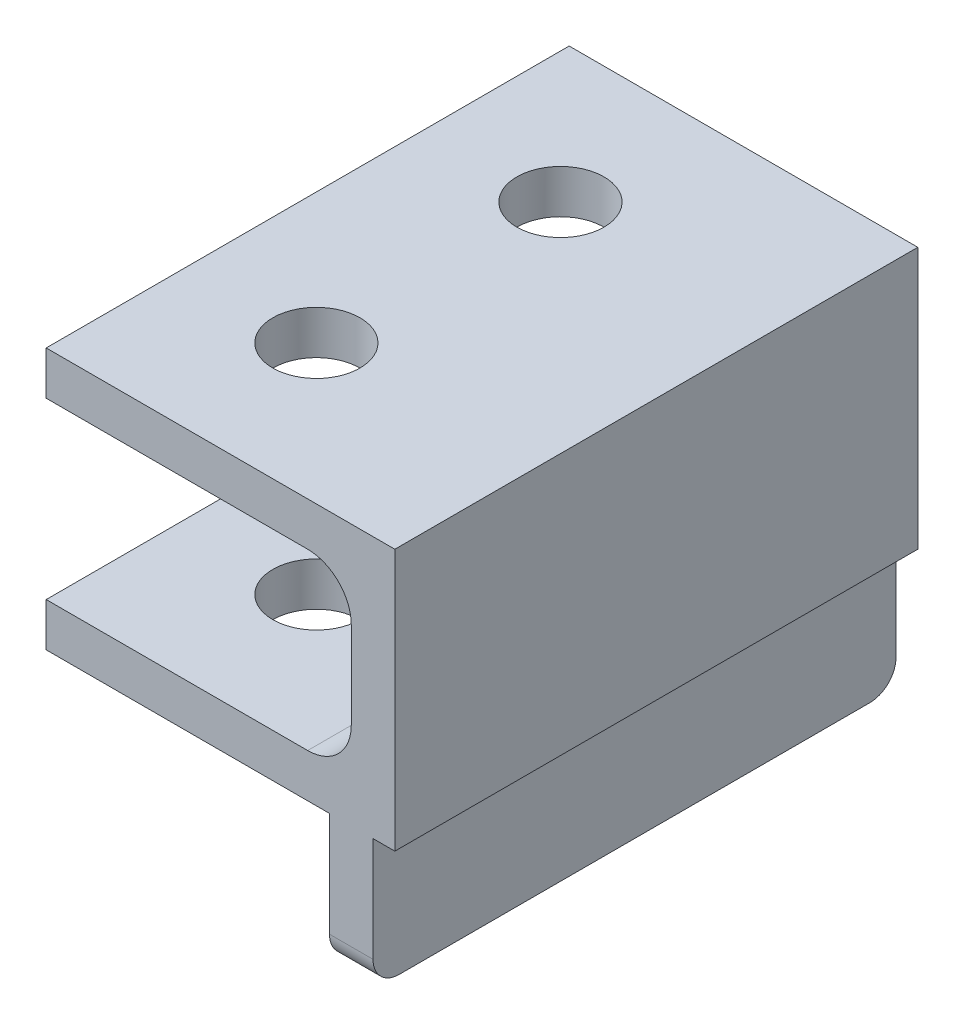
ISO-10303-21;
HEADER;
FILE_DESCRIPTION(('STEP AP214'),'2;1');
FILE_NAME('part.step','',(''),(''),'','','');
FILE_SCHEMA(('AUTOMOTIVE_DESIGN { 1 0 10303 214 1 1 1 1 }'));
ENDSEC;
DATA;
#1=APPLICATION_CONTEXT('core data for automotive mechanical design processes');
#2=APPLICATION_PROTOCOL_DEFINITION('international standard','automotive_design',2000,#1);
#3=PRODUCT_CONTEXT('',#1,'mechanical');
#4=PRODUCT('Part','Part','',(#3));
#5=PRODUCT_RELATED_PRODUCT_CATEGORY('part','',(#4));
#6=PRODUCT_DEFINITION_FORMATION('','',#4);
#7=PRODUCT_DEFINITION_CONTEXT('part definition',#1,'design');
#8=PRODUCT_DEFINITION('design','',#6,#7);
#9=PRODUCT_DEFINITION_SHAPE('','',#8);
#10=(LENGTH_UNIT() NAMED_UNIT(*) SI_UNIT(.MILLI.,.METRE.));
#11=(NAMED_UNIT(*) PLANE_ANGLE_UNIT() SI_UNIT($,.RADIAN.));
#12=(NAMED_UNIT(*) SI_UNIT($,.STERADIAN.) SOLID_ANGLE_UNIT());
#13=UNCERTAINTY_MEASURE_WITH_UNIT(LENGTH_MEASURE(1.E-05),#10,'distance_accuracy_value','');
#14=(GEOMETRIC_REPRESENTATION_CONTEXT(3) GLOBAL_UNCERTAINTY_ASSIGNED_CONTEXT((#13)) GLOBAL_UNIT_ASSIGNED_CONTEXT((#10,
#11,#12)) REPRESENTATION_CONTEXT('',''));
#15=CARTESIAN_POINT('',(0.,0.,0.));
#16=DIRECTION('',(0.,0.,1.));
#17=DIRECTION('',(1.,0.,0.));
#18=AXIS2_PLACEMENT_3D('',#15,#16,#17);
#19=CARTESIAN_POINT('',(0.,-25.,60.));
#20=DIRECTION('',(0.,1.,0.));
#21=DIRECTION('',(0.,0.,1.));
#22=AXIS2_PLACEMENT_3D('',#19,#20,#21);
#23=PLANE('',#22);
#24=DIRECTION('',(0.,0.,1.));
#25=VECTOR('',#24,1.);
#26=CARTESIAN_POINT('',(37.5,-25.,0.));
#27=LINE('',#26,#25);
#28=CARTESIAN_POINT('',(37.5,-25.,0.));
#29=VERTEX_POINT('',#28);
#30=CARTESIAN_POINT('',(37.5,-25.,60.));
#31=VERTEX_POINT('',#30);
#32=EDGE_CURVE('E160',#29,#31,#27,.T.);
#33=ORIENTED_EDGE('',*,*,#32,.F.);
#34=DIRECTION('',(1.,0.,0.));
#35=VECTOR('',#34,1.);
#36=CARTESIAN_POINT('',(0.,-25.,0.));
#37=LINE('',#36,#35);
#38=CARTESIAN_POINT('',(40.,-25.,0.));
#39=VERTEX_POINT('',#38);
#40=EDGE_CURVE('E238',#29,#39,#37,.T.);
#41=ORIENTED_EDGE('',*,*,#40,.T.);
#42=DIRECTION('',(0.,0.,-1.));
#43=VECTOR('',#42,1.);
#44=CARTESIAN_POINT('',(40.,-25.,60.));
#45=LINE('',#44,#43);
#46=CARTESIAN_POINT('',(40.,-25.,60.));
#47=VERTEX_POINT('',#46);
#48=EDGE_CURVE('E163',#47,#39,#45,.T.);
#49=ORIENTED_EDGE('',*,*,#48,.F.);
#50=DIRECTION('',(1.,0.,0.));
#51=VECTOR('',#50,1.);
#52=CARTESIAN_POINT('',(0.,-25.,60.));
#53=LINE('',#52,#51);
#54=EDGE_CURVE('E151',#31,#47,#53,.T.);
#55=ORIENTED_EDGE('',*,*,#54,.F.);
#56=EDGE_LOOP('',(#33,#41,#49,#55));
#57=FACE_BOUND('',#56,.T.);
#58=ADVANCED_FACE('F38',(#57),#23,.F.);
#59=CARTESIAN_POINT('',(0.,0.,60.));
#60=DIRECTION('',(0.,1.,0.));
#61=DIRECTION('',(0.,0.,1.));
#62=AXIS2_PLACEMENT_3D('',#59,#60,#61);
#63=PLANE('',#62);
#64=DIRECTION('',(1.,0.,0.));
#65=VECTOR('',#64,1.);
#66=CARTESIAN_POINT('',(0.,0.,0.));
#67=LINE('',#66,#65);
#68=CARTESIAN_POINT('',(0.,0.,0.));
#69=VERTEX_POINT('',#68);
#70=CARTESIAN_POINT('',(30.,0.,0.));
#71=VERTEX_POINT('',#70);
#72=EDGE_CURVE('E228',#69,#71,#67,.T.);
#73=ORIENTED_EDGE('',*,*,#72,.T.);
#74=DIRECTION('',(0.,0.,-1.));
#75=VECTOR('',#74,1.);
#76=CARTESIAN_POINT('',(30.,0.,60.));
#77=LINE('',#76,#75);
#78=CARTESIAN_POINT('',(30.,0.,60.));
#79=VERTEX_POINT('',#78);
#80=EDGE_CURVE('E268',#71,#79,#77,.F.);
#81=ORIENTED_EDGE('',*,*,#80,.T.);
#82=DIRECTION('',(1.,0.,0.));
#83=VECTOR('',#82,1.);
#84=CARTESIAN_POINT('',(0.,0.,60.));
#85=LINE('',#84,#83);
#86=CARTESIAN_POINT('',(0.,0.,60.));
#87=VERTEX_POINT('',#86);
#88=EDGE_CURVE('E210',#87,#79,#85,.T.);
#89=ORIENTED_EDGE('',*,*,#88,.F.);
#90=DIRECTION('',(0.,0.,-1.));
#91=VECTOR('',#90,1.);
#92=CARTESIAN_POINT('',(0.,0.,60.));
#93=LINE('',#92,#91);
#94=EDGE_CURVE('E257',#87,#69,#93,.T.);
#95=ORIENTED_EDGE('',*,*,#94,.T.);
#96=EDGE_LOOP('',(#73,#81,#89,#95));
#97=FACE_BOUND('',#96,.T.);
#98=CARTESIAN_POINT('',(15.,0.,16.));
#99=DIRECTION('',(0.,1.,0.));
#100=DIRECTION('',(0.,0.,1.));
#101=AXIS2_PLACEMENT_3D('',#98,#99,#100);
#102=CIRCLE('',#101,5.);
#103=CARTESIAN_POINT('',(15.,0.,21.));
#104=VERTEX_POINT('',#103);
#105=EDGE_CURVE('E194',#104,#104,#102,.F.);
#106=ORIENTED_EDGE('',*,*,#105,.F.);
#107=EDGE_LOOP('',(#106));
#108=FACE_BOUND('',#107,.T.);
#109=CARTESIAN_POINT('',(15.,0.,44.));
#110=DIRECTION('',(0.,1.,0.));
#111=DIRECTION('',(0.,0.,1.));
#112=AXIS2_PLACEMENT_3D('',#109,#110,#111);
#113=CIRCLE('',#112,5.);
#114=CARTESIAN_POINT('',(15.,0.,49.));
#115=VERTEX_POINT('',#114);
#116=EDGE_CURVE('E203',#115,#115,#113,.T.);
#117=ORIENTED_EDGE('',*,*,#116,.T.);
#118=EDGE_LOOP('',(#117));
#119=FACE_BOUND('',#118,.T.);
#120=ADVANCED_FACE('F330',(#97,#108,#119),#63,.F.);
#121=CARTESIAN_POINT('',(35.,-20.,60.));
#122=DIRECTION('',(0.,-1.,0.));
#123=DIRECTION('',(1.,0.,0.));
#124=AXIS2_PLACEMENT_3D('',#121,#122,#123);
#125=PLANE('',#124);
#126=DIRECTION('',(-1.,0.,0.));
#127=VECTOR('',#126,1.);
#128=CARTESIAN_POINT('',(35.,-20.,60.));
#129=LINE('',#128,#127);
#130=CARTESIAN_POINT('',(30.,-20.,60.));
#131=VERTEX_POINT('',#130);
#132=CARTESIAN_POINT('',(0.,-20.,60.));
#133=VERTEX_POINT('',#132);
#134=EDGE_CURVE('E217',#131,#133,#129,.T.);
#135=ORIENTED_EDGE('',*,*,#134,.F.);
#136=DIRECTION('',(0.,0.,-1.));
#137=VECTOR('',#136,1.);
#138=CARTESIAN_POINT('',(30.,-20.,0.));
#139=LINE('',#138,#137);
#140=CARTESIAN_POINT('',(30.,-20.,0.));
#141=VERTEX_POINT('',#140);
#142=EDGE_CURVE('E260',#131,#141,#139,.T.);
#143=ORIENTED_EDGE('',*,*,#142,.T.);
#144=DIRECTION('',(-1.,0.,0.));
#145=VECTOR('',#144,1.);
#146=CARTESIAN_POINT('',(35.,-20.,0.));
#147=LINE('',#146,#145);
#148=CARTESIAN_POINT('',(0.,-20.,0.));
#149=VERTEX_POINT('',#148);
#150=EDGE_CURVE('E234',#141,#149,#147,.T.);
#151=ORIENTED_EDGE('',*,*,#150,.T.);
#152=DIRECTION('',(0.,0.,-1.));
#153=VECTOR('',#152,1.);
#154=CARTESIAN_POINT('',(0.,-20.,60.));
#155=LINE('',#154,#153);
#156=EDGE_CURVE('E254',#133,#149,#155,.T.);
#157=ORIENTED_EDGE('',*,*,#156,.F.);
#158=EDGE_LOOP('',(#135,#143,#151,#157));
#159=FACE_BOUND('',#158,.T.);
#160=CARTESIAN_POINT('',(15.,-20.,16.));
#161=DIRECTION('',(0.,-1.,0.));
#162=DIRECTION('',(1.,0.,0.));
#163=AXIS2_PLACEMENT_3D('',#160,#161,#162);
#164=CIRCLE('',#163,5.);
#165=CARTESIAN_POINT('',(20.,-20.,16.));
#166=VERTEX_POINT('',#165);
#167=EDGE_CURVE('E191',#166,#166,#164,.F.);
#168=ORIENTED_EDGE('',*,*,#167,.F.);
#169=EDGE_LOOP('',(#168));
#170=FACE_BOUND('',#169,.T.);
#171=CARTESIAN_POINT('',(15.,-20.,44.));
#172=DIRECTION('',(0.,-1.,0.));
#173=DIRECTION('',(1.,0.,0.));
#174=AXIS2_PLACEMENT_3D('',#171,#172,#173);
#175=CIRCLE('',#174,5.);
#176=CARTESIAN_POINT('',(20.,-20.,44.));
#177=VERTEX_POINT('',#176);
#178=EDGE_CURVE('E200',#177,#177,#175,.T.);
#179=ORIENTED_EDGE('',*,*,#178,.T.);
#180=EDGE_LOOP('',(#179));
#181=FACE_BOUND('',#180,.T.);
#182=ADVANCED_FACE('F350',(#159,#170,#181),#125,.F.);
#183=CARTESIAN_POINT('',(0.,-25.,0.));
#184=VERTEX_POINT('',#183);
#185=CARTESIAN_POINT('',(32.5,-25.,0.));
#186=VERTEX_POINT('',#185);
#187=EDGE_CURVE('E239',#184,#186,#37,.T.);
#188=ORIENTED_EDGE('',*,*,#187,.T.);
#189=DIRECTION('',(0.,0.,1.));
#190=VECTOR('',#189,1.);
#191=CARTESIAN_POINT('',(32.5,-25.,0.));
#192=LINE('',#191,#190);
#193=CARTESIAN_POINT('',(32.5,-25.,60.));
#194=VERTEX_POINT('',#193);
#195=EDGE_CURVE('E169',#186,#194,#192,.T.);
#196=ORIENTED_EDGE('',*,*,#195,.T.);
#197=CARTESIAN_POINT('',(0.,-25.,60.));
#198=VERTEX_POINT('',#197);
#199=EDGE_CURVE('E165',#198,#194,#53,.T.);
#200=ORIENTED_EDGE('',*,*,#199,.F.);
#201=DIRECTION('',(0.,0.,-1.));
#202=VECTOR('',#201,1.);
#203=CARTESIAN_POINT('',(0.,-25.,60.));
#204=LINE('',#203,#202);
#205=EDGE_CURVE('E251',#198,#184,#204,.T.);
#206=ORIENTED_EDGE('',*,*,#205,.T.);
#207=EDGE_LOOP('',(#188,#196,#200,#206));
#208=FACE_BOUND('',#207,.T.);
#209=CARTESIAN_POINT('',(15.,-25.,16.));
#210=DIRECTION('',(0.,1.,0.));
#211=DIRECTION('',(0.,0.,1.));
#212=AXIS2_PLACEMENT_3D('',#209,#210,#211);
#213=CIRCLE('',#212,5.);
#214=CARTESIAN_POINT('',(15.,-25.,21.));
#215=VERTEX_POINT('',#214);
#216=EDGE_CURVE('E186',#215,#215,#213,.F.);
#217=ORIENTED_EDGE('',*,*,#216,.F.);
#218=EDGE_LOOP('',(#217));
#219=FACE_BOUND('',#218,.T.);
#220=CARTESIAN_POINT('',(15.,-25.,44.));
#221=DIRECTION('',(0.,1.,0.));
#222=DIRECTION('',(0.,0.,1.));
#223=AXIS2_PLACEMENT_3D('',#220,#221,#222);
#224=CIRCLE('',#223,5.);
#225=CARTESIAN_POINT('',(15.,-25.,49.));
#226=VERTEX_POINT('',#225);
#227=EDGE_CURVE('E197',#226,#226,#224,.T.);
#228=ORIENTED_EDGE('',*,*,#227,.T.);
#229=EDGE_LOOP('',(#228));
#230=FACE_BOUND('',#229,.T.);
#231=ADVANCED_FACE('F305',(#208,#219,#230),#23,.F.);
#232=CARTESIAN_POINT('',(40.,5.00000000000001,60.));
#233=DIRECTION('',(0.,-1.,0.));
#234=DIRECTION('',(1.,0.,0.));
#235=AXIS2_PLACEMENT_3D('',#232,#233,#234);
#236=PLANE('',#235);
#237=DIRECTION('',(-1.,0.,0.));
#238=VECTOR('',#237,1.);
#239=CARTESIAN_POINT('',(40.,5.00000000000001,0.));
#240=LINE('',#239,#238);
#241=CARTESIAN_POINT('',(40.,5.00000000000001,0.));
#242=VERTEX_POINT('',#241);
#243=CARTESIAN_POINT('',(0.,5.,0.));
#244=VERTEX_POINT('',#243);
#245=EDGE_CURVE('E211',#242,#244,#240,.T.);
#246=ORIENTED_EDGE('',*,*,#245,.T.);
#247=DIRECTION('',(0.,0.,-1.));
#248=VECTOR('',#247,1.);
#249=CARTESIAN_POINT('',(0.,5.,60.));
#250=LINE('',#249,#248);
#251=CARTESIAN_POINT('',(0.,5.,60.));
#252=VERTEX_POINT('',#251);
#253=EDGE_CURVE('E225',#252,#244,#250,.T.);
#254=ORIENTED_EDGE('',*,*,#253,.F.);
#255=DIRECTION('',(-1.,0.,0.));
#256=VECTOR('',#255,1.);
#257=CARTESIAN_POINT('',(40.,5.00000000000001,60.));
#258=LINE('',#257,#256);
#259=CARTESIAN_POINT('',(40.,5.00000000000001,60.));
#260=VERTEX_POINT('',#259);
#261=EDGE_CURVE('E223',#260,#252,#258,.T.);
#262=ORIENTED_EDGE('',*,*,#261,.F.);
#263=DIRECTION('',(0.,0.,-1.));
#264=VECTOR('',#263,1.);
#265=CARTESIAN_POINT('',(40.,5.00000000000001,60.));
#266=LINE('',#265,#264);
#267=EDGE_CURVE('E247',#260,#242,#266,.T.);
#268=ORIENTED_EDGE('',*,*,#267,.T.);
#269=EDGE_LOOP('',(#246,#254,#262,#268));
#270=FACE_BOUND('',#269,.T.);
#271=CARTESIAN_POINT('',(15.,5.,16.));
#272=DIRECTION('',(0.,-1.,0.));
#273=DIRECTION('',(1.,0.,0.));
#274=AXIS2_PLACEMENT_3D('',#271,#272,#273);
#275=CIRCLE('',#274,5.);
#276=CARTESIAN_POINT('',(20.,5.,16.));
#277=VERTEX_POINT('',#276);
#278=EDGE_CURVE('E182',#277,#277,#275,.T.);
#279=ORIENTED_EDGE('',*,*,#278,.T.);
#280=EDGE_LOOP('',(#279));
#281=FACE_BOUND('',#280,.T.);
#282=CARTESIAN_POINT('',(15.,5.,44.));
#283=DIRECTION('',(0.,1.,0.));
#284=DIRECTION('',(-1.,0.,0.));
#285=AXIS2_PLACEMENT_3D('',#282,#283,#284);
#286=CIRCLE('',#285,5.);
#287=CARTESIAN_POINT('',(10.,5.,44.));
#288=VERTEX_POINT('',#287);
#289=EDGE_CURVE('E183',#288,#288,#286,.T.);
#290=ORIENTED_EDGE('',*,*,#289,.F.);
#291=EDGE_LOOP('',(#290));
#292=FACE_BOUND('',#291,.T.);
#293=ADVANCED_FACE('F324',(#270,#281,#292),#236,.F.);
#294=CARTESIAN_POINT('',(0.,5.,60.));
#295=DIRECTION('',(1.,0.,0.));
#296=DIRECTION('',(0.,0.,-1.));
#297=AXIS2_PLACEMENT_3D('',#294,#295,#296);
#298=PLANE('',#297);
#299=DIRECTION('',(0.,-1.,0.));
#300=VECTOR('',#299,1.);
#301=CARTESIAN_POINT('',(0.,5.,0.));
#302=LINE('',#301,#300);
#303=EDGE_CURVE('E206',#244,#69,#302,.T.);
#304=ORIENTED_EDGE('',*,*,#303,.T.);
#305=ORIENTED_EDGE('',*,*,#94,.F.);
#306=DIRECTION('',(0.,-1.,0.));
#307=VECTOR('',#306,1.);
#308=CARTESIAN_POINT('',(0.,5.,60.));
#309=LINE('',#308,#307);
#310=EDGE_CURVE('E207',#252,#87,#309,.T.);
#311=ORIENTED_EDGE('',*,*,#310,.F.);
#312=ORIENTED_EDGE('',*,*,#253,.T.);
#313=EDGE_LOOP('',(#304,#305,#311,#312));
#314=FACE_BOUND('',#313,.T.);
#315=ADVANCED_FACE('F328',(#314),#298,.F.);
#316=CARTESIAN_POINT('',(35.,0.,60.));
#317=DIRECTION('',(1.,0.,0.));
#318=DIRECTION('',(0.,1.,0.));
#319=AXIS2_PLACEMENT_3D('',#316,#317,#318);
#320=PLANE('',#319);
#321=DIRECTION('',(0.,-1.,0.));
#322=VECTOR('',#321,1.);
#323=CARTESIAN_POINT('',(35.,0.,0.));
#324=LINE('',#323,#322);
#325=CARTESIAN_POINT('',(35.,-5.,0.));
#326=VERTEX_POINT('',#325);
#327=CARTESIAN_POINT('',(35.,-15.,0.));
#328=VERTEX_POINT('',#327);
#329=EDGE_CURVE('E231',#326,#328,#324,.T.);
#330=ORIENTED_EDGE('',*,*,#329,.T.);
#331=DIRECTION('',(0.,0.,-1.));
#332=VECTOR('',#331,1.);
#333=CARTESIAN_POINT('',(35.,-15.,60.));
#334=LINE('',#333,#332);
#335=CARTESIAN_POINT('',(35.,-15.,60.));
#336=VERTEX_POINT('',#335);
#337=EDGE_CURVE('E266',#328,#336,#334,.F.);
#338=ORIENTED_EDGE('',*,*,#337,.T.);
#339=DIRECTION('',(0.,-1.,0.));
#340=VECTOR('',#339,1.);
#341=CARTESIAN_POINT('',(35.,0.,60.));
#342=LINE('',#341,#340);
#343=CARTESIAN_POINT('',(35.,-5.,60.));
#344=VERTEX_POINT('',#343);
#345=EDGE_CURVE('E214',#344,#336,#342,.T.);
#346=ORIENTED_EDGE('',*,*,#345,.F.);
#347=DIRECTION('',(0.,0.,-1.));
#348=VECTOR('',#347,1.);
#349=CARTESIAN_POINT('',(35.,-5.,0.));
#350=LINE('',#349,#348);
#351=EDGE_CURVE('E263',#344,#326,#350,.T.);
#352=ORIENTED_EDGE('',*,*,#351,.T.);
#353=EDGE_LOOP('',(#330,#338,#346,#352));
#354=FACE_BOUND('',#353,.T.);
#355=ADVANCED_FACE('F340',(#354),#320,.F.);
#356=CARTESIAN_POINT('',(0.,-20.,60.));
#357=DIRECTION('',(1.,0.,0.));
#358=DIRECTION('',(0.,1.,0.));
#359=AXIS2_PLACEMENT_3D('',#356,#357,#358);
#360=PLANE('',#359);
#361=DIRECTION('',(0.,-1.,0.));
#362=VECTOR('',#361,1.);
#363=CARTESIAN_POINT('',(0.,-20.,0.));
#364=LINE('',#363,#362);
#365=EDGE_CURVE('E236',#149,#184,#364,.T.);
#366=ORIENTED_EDGE('',*,*,#365,.T.);
#367=ORIENTED_EDGE('',*,*,#205,.F.);
#368=DIRECTION('',(0.,-1.,0.));
#369=VECTOR('',#368,1.);
#370=CARTESIAN_POINT('',(0.,-20.,60.));
#371=LINE('',#370,#369);
#372=EDGE_CURVE('E166',#133,#198,#371,.T.);
#373=ORIENTED_EDGE('',*,*,#372,.F.);
#374=ORIENTED_EDGE('',*,*,#156,.T.);
#375=EDGE_LOOP('',(#366,#367,#373,#374));
#376=FACE_BOUND('',#375,.T.);
#377=ADVANCED_FACE('F354',(#376),#360,.F.);
#378=CARTESIAN_POINT('',(40.,-25.,60.));
#379=DIRECTION('',(-1.,0.,0.));
#380=DIRECTION('',(0.,0.,1.));
#381=AXIS2_PLACEMENT_3D('',#378,#379,#380);
#382=PLANE('',#381);
#383=DIRECTION('',(0.,1.,0.));
#384=VECTOR('',#383,1.);
#385=CARTESIAN_POINT('',(40.,-25.,0.));
#386=LINE('',#385,#384);
#387=EDGE_CURVE('E242',#39,#242,#386,.T.);
#388=ORIENTED_EDGE('',*,*,#387,.T.);
#389=ORIENTED_EDGE('',*,*,#267,.F.);
#390=DIRECTION('',(0.,1.,0.));
#391=VECTOR('',#390,1.);
#392=CARTESIAN_POINT('',(40.,-25.,60.));
#393=LINE('',#392,#391);
#394=EDGE_CURVE('E221',#47,#260,#393,.T.);
#395=ORIENTED_EDGE('',*,*,#394,.F.);
#396=ORIENTED_EDGE('',*,*,#48,.T.);
#397=EDGE_LOOP('',(#388,#389,#395,#396));
#398=FACE_BOUND('',#397,.T.);
#399=ADVANCED_FACE('F317',(#398),#382,.F.);
#400=CARTESIAN_POINT('',(0.,0.,60.));
#401=DIRECTION('',(0.,0.,1.));
#402=DIRECTION('',(1.,0.,0.));
#403=AXIS2_PLACEMENT_3D('',#400,#401,#402);
#404=PLANE('',#403);
#405=DIRECTION('',(0.,1.,0.));
#406=VECTOR('',#405,1.);
#407=CARTESIAN_POINT('',(32.5,-40.,60.));
#408=LINE('',#407,#406);
#409=CARTESIAN_POINT('',(32.5,-37.,60.));
#410=VERTEX_POINT('',#409);
#411=EDGE_CURVE('E156',#410,#194,#408,.T.);
#412=ORIENTED_EDGE('',*,*,#411,.F.);
#413=DIRECTION('',(-1.,0.,0.));
#414=VECTOR('',#413,1.);
#415=CARTESIAN_POINT('',(0.,-37.,60.));
#416=LINE('',#415,#414);
#417=CARTESIAN_POINT('',(37.5,-37.,60.));
#418=VERTEX_POINT('',#417);
#419=EDGE_CURVE('E61',#410,#418,#416,.F.);
#420=ORIENTED_EDGE('',*,*,#419,.T.);
#421=DIRECTION('',(0.,1.,0.));
#422=VECTOR('',#421,1.);
#423=CARTESIAN_POINT('',(37.5,-40.,60.));
#424=LINE('',#423,#422);
#425=EDGE_CURVE('E148',#418,#31,#424,.T.);
#426=ORIENTED_EDGE('',*,*,#425,.T.);
#427=ORIENTED_EDGE('',*,*,#54,.T.);
#428=ORIENTED_EDGE('',*,*,#394,.T.);
#429=ORIENTED_EDGE('',*,*,#261,.T.);
#430=ORIENTED_EDGE('',*,*,#310,.T.);
#431=ORIENTED_EDGE('',*,*,#88,.T.);
#432=CARTESIAN_POINT('',(30.,-5.,60.));
#433=DIRECTION('',(0.,0.,1.));
#434=DIRECTION('',(1.,0.,0.));
#435=AXIS2_PLACEMENT_3D('',#432,#433,#434);
#436=CIRCLE('',#435,5.);
#437=EDGE_CURVE('E276',#79,#344,#436,.F.);
#438=ORIENTED_EDGE('',*,*,#437,.T.);
#439=ORIENTED_EDGE('',*,*,#345,.T.);
#440=CARTESIAN_POINT('',(30.,-15.,60.));
#441=DIRECTION('',(0.,0.,1.));
#442=DIRECTION('',(1.,0.,0.));
#443=AXIS2_PLACEMENT_3D('',#440,#441,#442);
#444=CIRCLE('',#443,5.);
#445=EDGE_CURVE('E272',#336,#131,#444,.F.);
#446=ORIENTED_EDGE('',*,*,#445,.T.);
#447=ORIENTED_EDGE('',*,*,#134,.T.);
#448=ORIENTED_EDGE('',*,*,#372,.T.);
#449=ORIENTED_EDGE('',*,*,#199,.T.);
#450=EDGE_LOOP('',(#412,#420,#426,#427,#428,#429,#430,#431,#438,#439,#446,#447,#448,#449));
#451=FACE_BOUND('',#450,.T.);
#452=ADVANCED_FACE('F150',(#451),#404,.T.);
#453=CARTESIAN_POINT('',(0.,0.,0.));
#454=DIRECTION('',(0.,0.,1.));
#455=DIRECTION('',(1.,0.,0.));
#456=AXIS2_PLACEMENT_3D('',#453,#454,#455);
#457=PLANE('',#456);
#458=DIRECTION('',(0.,1.,0.));
#459=VECTOR('',#458,1.);
#460=CARTESIAN_POINT('',(37.5,-40.,0.));
#461=LINE('',#460,#459);
#462=CARTESIAN_POINT('',(37.5,-37.,0.));
#463=VERTEX_POINT('',#462);
#464=EDGE_CURVE('E155',#463,#29,#461,.T.);
#465=ORIENTED_EDGE('',*,*,#464,.F.);
#466=DIRECTION('',(1.,0.,0.));
#467=VECTOR('',#466,1.);
#468=CARTESIAN_POINT('',(32.5,-37.,0.));
#469=LINE('',#468,#467);
#470=CARTESIAN_POINT('',(32.5,-37.,0.));
#471=VERTEX_POINT('',#470);
#472=EDGE_CURVE('E11',#463,#471,#469,.F.);
#473=ORIENTED_EDGE('',*,*,#472,.T.);
#474=DIRECTION('',(0.,1.,0.));
#475=VECTOR('',#474,1.);
#476=CARTESIAN_POINT('',(32.5,-40.,0.));
#477=LINE('',#476,#475);
#478=EDGE_CURVE('E178',#471,#186,#477,.T.);
#479=ORIENTED_EDGE('',*,*,#478,.T.);
#480=ORIENTED_EDGE('',*,*,#187,.F.);
#481=ORIENTED_EDGE('',*,*,#365,.F.);
#482=ORIENTED_EDGE('',*,*,#150,.F.);
#483=CARTESIAN_POINT('',(30.,-15.,0.));
#484=DIRECTION('',(0.,0.,1.));
#485=DIRECTION('',(1.,0.,0.));
#486=AXIS2_PLACEMENT_3D('',#483,#484,#485);
#487=CIRCLE('',#486,5.);
#488=EDGE_CURVE('E270',#141,#328,#487,.T.);
#489=ORIENTED_EDGE('',*,*,#488,.T.);
#490=ORIENTED_EDGE('',*,*,#329,.F.);
#491=CARTESIAN_POINT('',(30.,-5.,0.));
#492=DIRECTION('',(0.,0.,1.));
#493=DIRECTION('',(1.,0.,0.));
#494=AXIS2_PLACEMENT_3D('',#491,#492,#493);
#495=CIRCLE('',#494,5.);
#496=EDGE_CURVE('E274',#326,#71,#495,.T.);
#497=ORIENTED_EDGE('',*,*,#496,.T.);
#498=ORIENTED_EDGE('',*,*,#72,.F.);
#499=ORIENTED_EDGE('',*,*,#303,.F.);
#500=ORIENTED_EDGE('',*,*,#245,.F.);
#501=ORIENTED_EDGE('',*,*,#387,.F.);
#502=ORIENTED_EDGE('',*,*,#40,.F.);
#503=EDGE_LOOP('',(#465,#473,#479,#480,#481,#482,#489,#490,#497,#498,#499,#500,#501,#502));
#504=FACE_BOUND('',#503,.T.);
#505=ADVANCED_FACE('F313',(#504),#457,.F.);
#506=CARTESIAN_POINT('',(30.,-15.,60.));
#507=DIRECTION('',(0.,0.,1.));
#508=DIRECTION('',(1.,0.,0.));
#509=AXIS2_PLACEMENT_3D('',#506,#507,#508);
#510=CYLINDRICAL_SURFACE('',#509,5.);
#511=ORIENTED_EDGE('',*,*,#445,.F.);
#512=ORIENTED_EDGE('',*,*,#337,.F.);
#513=ORIENTED_EDGE('',*,*,#488,.F.);
#514=ORIENTED_EDGE('',*,*,#142,.F.);
#515=EDGE_LOOP('',(#511,#512,#513,#514));
#516=FACE_BOUND('',#515,.T.);
#517=ADVANCED_FACE('F347',(#516),#510,.F.);
#518=CARTESIAN_POINT('',(30.,-5.,60.));
#519=DIRECTION('',(0.,0.,1.));
#520=DIRECTION('',(1.,0.,0.));
#521=AXIS2_PLACEMENT_3D('',#518,#519,#520);
#522=CYLINDRICAL_SURFACE('',#521,5.);
#523=ORIENTED_EDGE('',*,*,#437,.F.);
#524=ORIENTED_EDGE('',*,*,#80,.F.);
#525=ORIENTED_EDGE('',*,*,#496,.F.);
#526=ORIENTED_EDGE('',*,*,#351,.F.);
#527=EDGE_LOOP('',(#523,#524,#525,#526));
#528=FACE_BOUND('',#527,.T.);
#529=ADVANCED_FACE('F337',(#528),#522,.F.);
#530=CARTESIAN_POINT('',(15.,-70.,16.));
#531=DIRECTION('',(0.,1.,0.));
#532=DIRECTION('',(-1.,0.,0.));
#533=AXIS2_PLACEMENT_3D('',#530,#531,#532);
#534=CYLINDRICAL_SURFACE('',#533,5.);
#535=ORIENTED_EDGE('',*,*,#278,.F.);
#536=EDGE_LOOP('',(#535));
#537=FACE_BOUND('',#536,.T.);
#538=ORIENTED_EDGE('',*,*,#105,.T.);
#539=EDGE_LOOP('',(#538));
#540=FACE_BOUND('',#539,.T.);
#541=ADVANCED_FACE('F384',(#537,#540),#534,.F.);
#542=CARTESIAN_POINT('',(15.,-70.,44.));
#543=DIRECTION('',(0.,1.,0.));
#544=DIRECTION('',(-1.,0.,0.));
#545=AXIS2_PLACEMENT_3D('',#542,#543,#544);
#546=CYLINDRICAL_SURFACE('',#545,5.);
#547=ORIENTED_EDGE('',*,*,#289,.T.);
#548=EDGE_LOOP('',(#547));
#549=FACE_BOUND('',#548,.T.);
#550=ORIENTED_EDGE('',*,*,#116,.F.);
#551=EDGE_LOOP('',(#550));
#552=FACE_BOUND('',#551,.T.);
#553=ADVANCED_FACE('F399',(#549,#552),#546,.F.);
#554=ORIENTED_EDGE('',*,*,#216,.T.);
#555=EDGE_LOOP('',(#554));
#556=FACE_BOUND('',#555,.T.);
#557=ORIENTED_EDGE('',*,*,#167,.T.);
#558=EDGE_LOOP('',(#557));
#559=FACE_BOUND('',#558,.T.);
#560=ADVANCED_FACE('F402',(#556,#559),#534,.F.);
#561=ORIENTED_EDGE('',*,*,#227,.F.);
#562=EDGE_LOOP('',(#561));
#563=FACE_BOUND('',#562,.T.);
#564=ORIENTED_EDGE('',*,*,#178,.F.);
#565=EDGE_LOOP('',(#564));
#566=FACE_BOUND('',#565,.T.);
#567=ADVANCED_FACE('F398',(#563,#566),#546,.F.);
#568=CARTESIAN_POINT('',(37.5,-40.,0.));
#569=DIRECTION('',(-1.,0.,0.));
#570=DIRECTION('',(0.,0.,1.));
#571=AXIS2_PLACEMENT_3D('',#568,#569,#570);
#572=PLANE('',#571);
#573=ORIENTED_EDGE('',*,*,#425,.F.);
#574=CARTESIAN_POINT('',(37.5,-37.,57.));
#575=DIRECTION('',(-1.,0.,0.));
#576=DIRECTION('',(0.,0.,1.));
#577=AXIS2_PLACEMENT_3D('',#574,#575,#576);
#578=CIRCLE('',#577,3.);
#579=CARTESIAN_POINT('',(37.5,-40.,57.));
#580=VERTEX_POINT('',#579);
#581=EDGE_CURVE('E46',#418,#580,#578,.F.);
#582=ORIENTED_EDGE('',*,*,#581,.T.);
#583=DIRECTION('',(0.,0.,1.));
#584=VECTOR('',#583,1.);
#585=CARTESIAN_POINT('',(37.5,-40.,0.));
#586=LINE('',#585,#584);
#587=CARTESIAN_POINT('',(37.5,-40.,3.));
#588=VERTEX_POINT('',#587);
#589=EDGE_CURVE('E172',#588,#580,#586,.T.);
#590=ORIENTED_EDGE('',*,*,#589,.F.);
#591=CARTESIAN_POINT('',(37.5,-37.,3.));
#592=DIRECTION('',(-1.,0.,0.));
#593=DIRECTION('',(0.,0.,1.));
#594=AXIS2_PLACEMENT_3D('',#591,#592,#593);
#595=CIRCLE('',#594,3.);
#596=EDGE_CURVE('E53',#588,#463,#595,.F.);
#597=ORIENTED_EDGE('',*,*,#596,.T.);
#598=ORIENTED_EDGE('',*,*,#464,.T.);
#599=ORIENTED_EDGE('',*,*,#32,.T.);
#600=EDGE_LOOP('',(#573,#582,#590,#597,#598,#599));
#601=FACE_BOUND('',#600,.T.);
#602=ADVANCED_FACE('F168',(#601),#572,.F.);
#603=CARTESIAN_POINT('',(32.5,-40.,0.));
#604=DIRECTION('',(-1.,0.,0.));
#605=DIRECTION('',(0.,0.,1.));
#606=AXIS2_PLACEMENT_3D('',#603,#604,#605);
#607=PLANE('',#606);
#608=DIRECTION('',(0.,0.,1.));
#609=VECTOR('',#608,1.);
#610=CARTESIAN_POINT('',(32.5,-40.,0.));
#611=LINE('',#610,#609);
#612=CARTESIAN_POINT('',(32.5,-40.,3.));
#613=VERTEX_POINT('',#612);
#614=CARTESIAN_POINT('',(32.5,-40.,57.));
#615=VERTEX_POINT('',#614);
#616=EDGE_CURVE('E175',#613,#615,#611,.T.);
#617=ORIENTED_EDGE('',*,*,#616,.T.);
#618=CARTESIAN_POINT('',(32.5,-37.,57.));
#619=DIRECTION('',(-1.,0.,0.));
#620=DIRECTION('',(0.,0.,1.));
#621=AXIS2_PLACEMENT_3D('',#618,#619,#620);
#622=CIRCLE('',#621,3.);
#623=EDGE_CURVE('E286',#615,#410,#622,.T.);
#624=ORIENTED_EDGE('',*,*,#623,.T.);
#625=ORIENTED_EDGE('',*,*,#411,.T.);
#626=ORIENTED_EDGE('',*,*,#195,.F.);
#627=ORIENTED_EDGE('',*,*,#478,.F.);
#628=CARTESIAN_POINT('',(32.5,-37.,3.));
#629=DIRECTION('',(-1.,0.,0.));
#630=DIRECTION('',(0.,0.,1.));
#631=AXIS2_PLACEMENT_3D('',#628,#629,#630);
#632=CIRCLE('',#631,3.);
#633=EDGE_CURVE('E284',#471,#613,#632,.T.);
#634=ORIENTED_EDGE('',*,*,#633,.T.);
#635=EDGE_LOOP('',(#617,#624,#625,#626,#627,#634));
#636=FACE_BOUND('',#635,.T.);
#637=ADVANCED_FACE('F299',(#636),#607,.T.);
#638=CARTESIAN_POINT('',(0.,-40.,0.));
#639=DIRECTION('',(0.,-1.,0.));
#640=DIRECTION('',(0.,0.,-1.));
#641=AXIS2_PLACEMENT_3D('',#638,#639,#640);
#642=PLANE('',#641);
#643=ORIENTED_EDGE('',*,*,#589,.T.);
#644=DIRECTION('',(-1.,0.,0.));
#645=VECTOR('',#644,1.);
#646=CARTESIAN_POINT('',(0.,-40.,57.));
#647=LINE('',#646,#645);
#648=EDGE_CURVE('E281',#580,#615,#647,.T.);
#649=ORIENTED_EDGE('',*,*,#648,.T.);
#650=ORIENTED_EDGE('',*,*,#616,.F.);
#651=DIRECTION('',(1.,0.,0.));
#652=VECTOR('',#651,1.);
#653=CARTESIAN_POINT('',(37.5,-40.,3.));
#654=LINE('',#653,#652);
#655=EDGE_CURVE('E278',#613,#588,#654,.T.);
#656=ORIENTED_EDGE('',*,*,#655,.T.);
#657=EDGE_LOOP('',(#643,#649,#650,#656));
#658=FACE_BOUND('',#657,.T.);
#659=ADVANCED_FACE('F293',(#658),#642,.T.);
#660=CARTESIAN_POINT('',(0.,-37.,57.));
#661=DIRECTION('',(-1.,0.,0.));
#662=DIRECTION('',(0.,0.,1.));
#663=AXIS2_PLACEMENT_3D('',#660,#661,#662);
#664=CYLINDRICAL_SURFACE('',#663,3.);
#665=ORIENTED_EDGE('',*,*,#581,.F.);
#666=ORIENTED_EDGE('',*,*,#419,.F.);
#667=ORIENTED_EDGE('',*,*,#623,.F.);
#668=ORIENTED_EDGE('',*,*,#648,.F.);
#669=EDGE_LOOP('',(#665,#666,#667,#668));
#670=FACE_BOUND('',#669,.T.);
#671=ADVANCED_FACE('F297',(#670),#664,.T.);
#672=CARTESIAN_POINT('',(0.,-37.,3.));
#673=DIRECTION('',(-1.,0.,0.));
#674=DIRECTION('',(0.,0.,1.));
#675=AXIS2_PLACEMENT_3D('',#672,#673,#674);
#676=CYLINDRICAL_SURFACE('',#675,3.);
#677=ORIENTED_EDGE('',*,*,#633,.F.);
#678=ORIENTED_EDGE('',*,*,#472,.F.);
#679=ORIENTED_EDGE('',*,*,#596,.F.);
#680=ORIENTED_EDGE('',*,*,#655,.F.);
#681=EDGE_LOOP('',(#677,#678,#679,#680));
#682=FACE_BOUND('',#681,.T.);
#683=ADVANCED_FACE('F40',(#682),#676,.T.);
#684=CLOSED_SHELL('',(#58,#120,#182,#231,#293,#315,#355,#377,#399,#452,#505,#517,#529,#541,#553,
#560,#567,#602,#637,#659,#671,#683));
#685=MANIFOLD_SOLID_BREP('B2',#684);
#686=ADVANCED_BREP_SHAPE_REPRESENTATION('',(#18,#685),#14);
#687=SHAPE_DEFINITION_REPRESENTATION(#9,#686);
ENDSEC;
END-ISO-10303-21;
